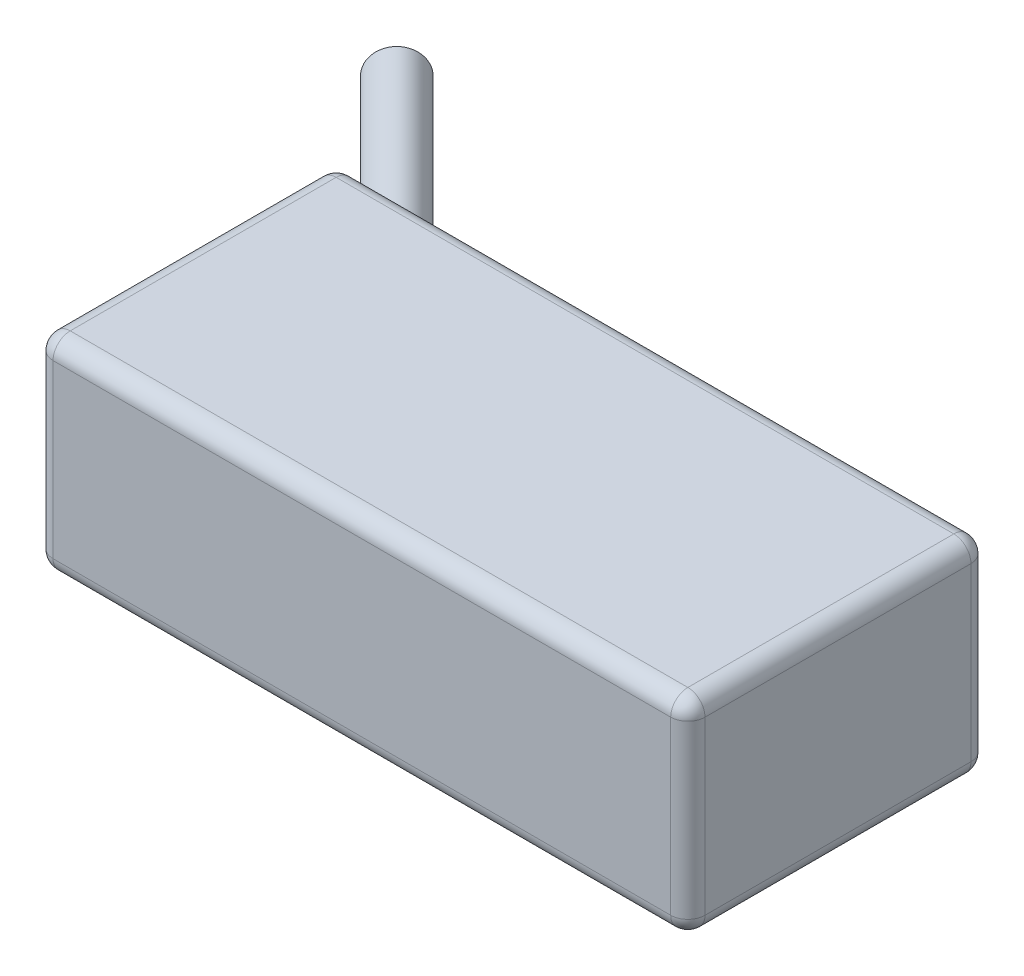
ISO-10303-21;
HEADER;
FILE_DESCRIPTION(('STEP AP214'),'2;1');
FILE_NAME('part.step','',(''),(''),'','','');
FILE_SCHEMA(('AUTOMOTIVE_DESIGN { 1 0 10303 214 1 1 1 1 }'));
ENDSEC;
DATA;
#1=APPLICATION_CONTEXT('core data for automotive mechanical design processes');
#2=APPLICATION_PROTOCOL_DEFINITION('international standard','automotive_design',2000,#1);
#3=PRODUCT_CONTEXT('',#1,'mechanical');
#4=PRODUCT('Part','Part','',(#3));
#5=PRODUCT_RELATED_PRODUCT_CATEGORY('part','',(#4));
#6=PRODUCT_DEFINITION_FORMATION('','',#4);
#7=PRODUCT_DEFINITION_CONTEXT('part definition',#1,'design');
#8=PRODUCT_DEFINITION('design','',#6,#7);
#9=PRODUCT_DEFINITION_SHAPE('','',#8);
#10=(LENGTH_UNIT() NAMED_UNIT(*) SI_UNIT(.MILLI.,.METRE.));
#11=(NAMED_UNIT(*) PLANE_ANGLE_UNIT() SI_UNIT($,.RADIAN.));
#12=(NAMED_UNIT(*) SI_UNIT($,.STERADIAN.) SOLID_ANGLE_UNIT());
#13=UNCERTAINTY_MEASURE_WITH_UNIT(LENGTH_MEASURE(1.E-05),#10,'distance_accuracy_value','');
#14=(GEOMETRIC_REPRESENTATION_CONTEXT(3) GLOBAL_UNCERTAINTY_ASSIGNED_CONTEXT((#13)) GLOBAL_UNIT_ASSIGNED_CONTEXT((#10,
#11,#12)) REPRESENTATION_CONTEXT('',''));
#15=CARTESIAN_POINT('',(0.,0.,0.));
#16=DIRECTION('',(0.,0.,1.));
#17=DIRECTION('',(1.,0.,0.));
#18=AXIS2_PLACEMENT_3D('',#15,#16,#17);
#19=CARTESIAN_POINT('',(38.,12.,-17.5));
#20=DIRECTION('',(-1.,0.,0.));
#21=DIRECTION('',(0.,0.,1.));
#22=AXIS2_PLACEMENT_3D('',#19,#20,#21);
#23=PLANE('',#22);
#24=DIRECTION('',(0.,-1.,0.));
#25=VECTOR('',#24,1.);
#26=CARTESIAN_POINT('',(38.,12.,15.5));
#27=LINE('',#26,#25);
#28=CARTESIAN_POINT('',(38.,10.,15.5));
#29=VERTEX_POINT('',#28);
#30=CARTESIAN_POINT('',(38.,-10.,15.5));
#31=VERTEX_POINT('',#30);
#32=EDGE_CURVE('E165',#29,#31,#27,.T.);
#33=ORIENTED_EDGE('',*,*,#32,.T.);
#34=DIRECTION('',(0.,0.,-1.));
#35=VECTOR('',#34,1.);
#36=CARTESIAN_POINT('',(38.,-10.,-17.5));
#37=LINE('',#36,#35);
#38=CARTESIAN_POINT('',(38.,-10.,-15.5));
#39=VERTEX_POINT('',#38);
#40=EDGE_CURVE('E170',#31,#39,#37,.T.);
#41=ORIENTED_EDGE('',*,*,#40,.T.);
#42=DIRECTION('',(0.,-1.,0.));
#43=VECTOR('',#42,1.);
#44=CARTESIAN_POINT('',(38.,12.,-15.5));
#45=LINE('',#44,#43);
#46=CARTESIAN_POINT('',(38.,10.,-15.5));
#47=VERTEX_POINT('',#46);
#48=EDGE_CURVE('E167',#39,#47,#45,.F.);
#49=ORIENTED_EDGE('',*,*,#48,.T.);
#50=DIRECTION('',(0.,0.,-1.));
#51=VECTOR('',#50,1.);
#52=CARTESIAN_POINT('',(38.,10.,17.5));
#53=LINE('',#52,#51);
#54=EDGE_CURVE('E163',#47,#29,#53,.F.);
#55=ORIENTED_EDGE('',*,*,#54,.T.);
#56=EDGE_LOOP('',(#33,#41,#49,#55));
#57=FACE_BOUND('',#56,.T.);
#58=ADVANCED_FACE('F36',(#57),#23,.F.);
#59=CARTESIAN_POINT('',(-38.,12.,-17.5));
#60=DIRECTION('',(0.,0.,1.));
#61=DIRECTION('',(1.,0.,0.));
#62=AXIS2_PLACEMENT_3D('',#59,#60,#61);
#63=PLANE('',#62);
#64=DIRECTION('',(0.,-1.,0.));
#65=VECTOR('',#64,1.);
#66=CARTESIAN_POINT('',(36.,12.,-17.5));
#67=LINE('',#66,#65);
#68=CARTESIAN_POINT('',(36.,10.,-17.5));
#69=VERTEX_POINT('',#68);
#70=CARTESIAN_POINT('',(36.,-10.,-17.5));
#71=VERTEX_POINT('',#70);
#72=EDGE_CURVE('E158',#69,#71,#67,.T.);
#73=ORIENTED_EDGE('',*,*,#72,.T.);
#74=DIRECTION('',(-1.,0.,0.));
#75=VECTOR('',#74,1.);
#76=CARTESIAN_POINT('',(-38.,-10.,-17.5));
#77=LINE('',#76,#75);
#78=CARTESIAN_POINT('',(-36.,-10.,-17.5));
#79=VERTEX_POINT('',#78);
#80=EDGE_CURVE('E161',#71,#79,#77,.T.);
#81=ORIENTED_EDGE('',*,*,#80,.T.);
#82=DIRECTION('',(0.,-1.,0.));
#83=VECTOR('',#82,1.);
#84=CARTESIAN_POINT('',(-36.,12.,-17.5));
#85=LINE('',#84,#83);
#86=CARTESIAN_POINT('',(-36.,10.,-17.5));
#87=VERTEX_POINT('',#86);
#88=EDGE_CURVE('E153',#79,#87,#85,.F.);
#89=ORIENTED_EDGE('',*,*,#88,.T.);
#90=DIRECTION('',(-1.,0.,0.));
#91=VECTOR('',#90,1.);
#92=CARTESIAN_POINT('',(38.,10.,-17.5));
#93=LINE('',#92,#91);
#94=EDGE_CURVE('E151',#87,#69,#93,.F.);
#95=ORIENTED_EDGE('',*,*,#94,.T.);
#96=EDGE_LOOP('',(#73,#81,#89,#95));
#97=FACE_BOUND('',#96,.T.);
#98=DIRECTION('',(0.,1.,0.));
#99=VECTOR('',#98,1.);
#100=CARTESIAN_POINT('',(-27.9999999999999,12.,-17.5));
#101=LINE('',#100,#99);
#102=CARTESIAN_POINT('',(-27.9999999999999,-6.17040966608938,-17.5));
#103=VERTEX_POINT('',#102);
#104=CARTESIAN_POINT('',(-27.9999999999999,-1.82959033391062,-17.5));
#105=VERTEX_POINT('',#104);
#106=EDGE_CURVE('E135',#103,#105,#101,.T.);
#107=ORIENTED_EDGE('',*,*,#106,.T.);
#108=CARTESIAN_POINT('',(-30.9289321881345,-4.,-17.5));
#109=DIRECTION('',(0.,0.,1.));
#110=DIRECTION('',(1.,0.,0.));
#111=AXIS2_PLACEMENT_3D('',#108,#109,#110);
#112=ELLIPSE('',#111,4.24264068711925,2.99999999999999);
#113=EDGE_CURVE('E142',#105,#103,#112,.T.);
#114=ORIENTED_EDGE('',*,*,#113,.T.);
#115=EDGE_LOOP('',(#107,#114));
#116=FACE_BOUND('',#115,.T.);
#117=DIRECTION('',(0.,1.,0.));
#118=VECTOR('',#117,1.);
#119=CARTESIAN_POINT('',(-27.9999999999999,12.,-17.5));
#120=LINE('',#119,#118);
#121=CARTESIAN_POINT('',(-27.9999999999999,1.8295903339106,-17.5));
#122=VERTEX_POINT('',#121);
#123=CARTESIAN_POINT('',(-27.9999999999999,6.1704096660894,-17.5));
#124=VERTEX_POINT('',#123);
#125=EDGE_CURVE('E627',#122,#124,#120,.T.);
#126=ORIENTED_EDGE('',*,*,#125,.T.);
#127=CARTESIAN_POINT('',(-30.9289321881345,4.,-17.5));
#128=DIRECTION('',(0.,0.,1.));
#129=DIRECTION('',(1.,0.,0.));
#130=AXIS2_PLACEMENT_3D('',#127,#128,#129);
#131=ELLIPSE('',#130,4.24264068711927,3.);
#132=EDGE_CURVE('E143',#124,#122,#131,.T.);
#133=ORIENTED_EDGE('',*,*,#132,.T.);
#134=EDGE_LOOP('',(#126,#133));
#135=FACE_BOUND('',#134,.T.);
#136=ADVANCED_FACE('F149',(#97,#116,#135),#63,.F.);
#137=CARTESIAN_POINT('',(-38.,12.,-17.5));
#138=DIRECTION('',(1.,0.,0.));
#139=DIRECTION('',(0.,0.,-1.));
#140=AXIS2_PLACEMENT_3D('',#137,#138,#139);
#141=PLANE('',#140);
#142=DIRECTION('',(0.,-1.,0.));
#143=VECTOR('',#142,1.);
#144=CARTESIAN_POINT('',(-38.,12.,-15.5));
#145=LINE('',#144,#143);
#146=CARTESIAN_POINT('',(-38.,10.,-15.5));
#147=VERTEX_POINT('',#146);
#148=CARTESIAN_POINT('',(-38.,-10.,-15.5));
#149=VERTEX_POINT('',#148);
#150=EDGE_CURVE('E176',#147,#149,#145,.T.);
#151=ORIENTED_EDGE('',*,*,#150,.T.);
#152=DIRECTION('',(0.,0.,1.));
#153=VECTOR('',#152,1.);
#154=CARTESIAN_POINT('',(-38.,-10.,-17.5));
#155=LINE('',#154,#153);
#156=CARTESIAN_POINT('',(-38.,-10.,15.5));
#157=VERTEX_POINT('',#156);
#158=EDGE_CURVE('E179',#149,#157,#155,.T.);
#159=ORIENTED_EDGE('',*,*,#158,.T.);
#160=DIRECTION('',(0.,-1.,0.));
#161=VECTOR('',#160,1.);
#162=CARTESIAN_POINT('',(-38.,12.,15.5));
#163=LINE('',#162,#161);
#164=CARTESIAN_POINT('',(-38.,10.,15.5));
#165=VERTEX_POINT('',#164);
#166=EDGE_CURVE('E174',#157,#165,#163,.F.);
#167=ORIENTED_EDGE('',*,*,#166,.T.);
#168=DIRECTION('',(0.,0.,1.));
#169=VECTOR('',#168,1.);
#170=CARTESIAN_POINT('',(-38.,10.,-17.5));
#171=LINE('',#170,#169);
#172=EDGE_CURVE('E172',#165,#147,#171,.F.);
#173=ORIENTED_EDGE('',*,*,#172,.T.);
#174=EDGE_LOOP('',(#151,#159,#167,#173));
#175=FACE_BOUND('',#174,.T.);
#176=ADVANCED_FACE('F318',(#175),#141,.F.);
#177=CARTESIAN_POINT('',(-38.,12.,17.5));
#178=DIRECTION('',(0.,0.,-1.));
#179=DIRECTION('',(-1.,0.,0.));
#180=AXIS2_PLACEMENT_3D('',#177,#178,#179);
#181=PLANE('',#180);
#182=DIRECTION('',(0.,-1.,0.));
#183=VECTOR('',#182,1.);
#184=CARTESIAN_POINT('',(-36.,12.,17.5));
#185=LINE('',#184,#183);
#186=CARTESIAN_POINT('',(-36.,10.,17.5));
#187=VERTEX_POINT('',#186);
#188=CARTESIAN_POINT('',(-36.,-10.,17.5));
#189=VERTEX_POINT('',#188);
#190=EDGE_CURVE('E185',#187,#189,#185,.T.);
#191=ORIENTED_EDGE('',*,*,#190,.T.);
#192=DIRECTION('',(1.,0.,0.));
#193=VECTOR('',#192,1.);
#194=CARTESIAN_POINT('',(-38.,-10.,17.5));
#195=LINE('',#194,#193);
#196=CARTESIAN_POINT('',(36.,-10.,17.5));
#197=VERTEX_POINT('',#196);
#198=EDGE_CURVE('E188',#189,#197,#195,.T.);
#199=ORIENTED_EDGE('',*,*,#198,.T.);
#200=DIRECTION('',(0.,-1.,0.));
#201=VECTOR('',#200,1.);
#202=CARTESIAN_POINT('',(36.,12.,17.5));
#203=LINE('',#202,#201);
#204=CARTESIAN_POINT('',(36.,10.,17.5));
#205=VERTEX_POINT('',#204);
#206=EDGE_CURVE('E183',#197,#205,#203,.F.);
#207=ORIENTED_EDGE('',*,*,#206,.T.);
#208=DIRECTION('',(1.,0.,0.));
#209=VECTOR('',#208,1.);
#210=CARTESIAN_POINT('',(-38.,10.,17.5));
#211=LINE('',#210,#209);
#212=EDGE_CURVE('E181',#205,#187,#211,.F.);
#213=ORIENTED_EDGE('',*,*,#212,.T.);
#214=EDGE_LOOP('',(#191,#199,#207,#213));
#215=FACE_BOUND('',#214,.T.);
#216=ADVANCED_FACE('F321',(#215),#181,.F.);
#217=CARTESIAN_POINT('',(0.,12.,0.));
#218=DIRECTION('',(0.,1.,0.));
#219=DIRECTION('',(0.,0.,1.));
#220=AXIS2_PLACEMENT_3D('',#217,#218,#219);
#221=PLANE('',#220);
#222=DIRECTION('',(0.,0.,1.));
#223=VECTOR('',#222,1.);
#224=CARTESIAN_POINT('',(-36.,12.,17.5));
#225=LINE('',#224,#223);
#226=CARTESIAN_POINT('',(-36.,12.,-15.5));
#227=VERTEX_POINT('',#226);
#228=CARTESIAN_POINT('',(-36.,12.,15.5));
#229=VERTEX_POINT('',#228);
#230=EDGE_CURVE('E45',#227,#229,#225,.T.);
#231=ORIENTED_EDGE('',*,*,#230,.T.);
#232=DIRECTION('',(1.,0.,0.));
#233=VECTOR('',#232,1.);
#234=CARTESIAN_POINT('',(38.,12.,15.5));
#235=LINE('',#234,#233);
#236=CARTESIAN_POINT('',(36.,12.,15.5));
#237=VERTEX_POINT('',#236);
#238=EDGE_CURVE('E11',#229,#237,#235,.T.);
#239=ORIENTED_EDGE('',*,*,#238,.T.);
#240=DIRECTION('',(0.,0.,-1.));
#241=VECTOR('',#240,1.);
#242=CARTESIAN_POINT('',(36.,12.,-17.5));
#243=LINE('',#242,#241);
#244=CARTESIAN_POINT('',(36.,12.,-15.5));
#245=VERTEX_POINT('',#244);
#246=EDGE_CURVE('E199',#237,#245,#243,.T.);
#247=ORIENTED_EDGE('',*,*,#246,.T.);
#248=DIRECTION('',(-1.,0.,0.));
#249=VECTOR('',#248,1.);
#250=CARTESIAN_POINT('',(-38.,12.,-15.5));
#251=LINE('',#250,#249);
#252=EDGE_CURVE('E56',#245,#227,#251,.T.);
#253=ORIENTED_EDGE('',*,*,#252,.T.);
#254=EDGE_LOOP('',(#231,#239,#247,#253));
#255=FACE_BOUND('',#254,.T.);
#256=ADVANCED_FACE('F285',(#255),#221,.T.);
#257=CARTESIAN_POINT('',(0.,-12.,0.));
#258=DIRECTION('',(0.,1.,0.));
#259=DIRECTION('',(0.,0.,1.));
#260=AXIS2_PLACEMENT_3D('',#257,#258,#259);
#261=PLANE('',#260);
#262=DIRECTION('',(0.,0.,1.));
#263=VECTOR('',#262,1.);
#264=CARTESIAN_POINT('',(-36.,-12.,0.));
#265=LINE('',#264,#263);
#266=CARTESIAN_POINT('',(-36.,-12.,15.5));
#267=VERTEX_POINT('',#266);
#268=CARTESIAN_POINT('',(-36.,-12.,-15.5));
#269=VERTEX_POINT('',#268);
#270=EDGE_CURVE('E194',#267,#269,#265,.F.);
#271=ORIENTED_EDGE('',*,*,#270,.T.);
#272=DIRECTION('',(-1.,0.,0.));
#273=VECTOR('',#272,1.);
#274=CARTESIAN_POINT('',(0.,-12.,-15.5));
#275=LINE('',#274,#273);
#276=CARTESIAN_POINT('',(36.,-12.,-15.5));
#277=VERTEX_POINT('',#276);
#278=EDGE_CURVE('E196',#269,#277,#275,.F.);
#279=ORIENTED_EDGE('',*,*,#278,.T.);
#280=DIRECTION('',(0.,0.,-1.));
#281=VECTOR('',#280,1.);
#282=CARTESIAN_POINT('',(36.,-12.,0.));
#283=LINE('',#282,#281);
#284=CARTESIAN_POINT('',(36.,-12.,15.5));
#285=VERTEX_POINT('',#284);
#286=EDGE_CURVE('E190',#277,#285,#283,.F.);
#287=ORIENTED_EDGE('',*,*,#286,.T.);
#288=DIRECTION('',(1.,0.,0.));
#289=VECTOR('',#288,1.);
#290=CARTESIAN_POINT('',(0.,-12.,15.5));
#291=LINE('',#290,#289);
#292=EDGE_CURVE('E192',#285,#267,#291,.F.);
#293=ORIENTED_EDGE('',*,*,#292,.T.);
#294=EDGE_LOOP('',(#271,#279,#287,#293));
#295=FACE_BOUND('',#294,.T.);
#296=ADVANCED_FACE('F565',(#295),#261,.F.);
#297=CARTESIAN_POINT('',(-50.6776695296635,4.,-37.2487373415292));
#298=DIRECTION('',(0.707106781186544,0.,0.707106781186551));
#299=DIRECTION('',(0.707106781186551,0.,-0.707106781186544));
#300=AXIS2_PLACEMENT_3D('',#297,#298,#299);
#301=CYLINDRICAL_SURFACE('',#300,3.);
#302=CARTESIAN_POINT('',(-50.6776695296635,4.,-37.2487373415292));
#303=DIRECTION('',(0.707106781186544,0.,0.707106781186551));
#304=DIRECTION('',(0.707106781186551,0.,-0.707106781186544));
#305=AXIS2_PLACEMENT_3D('',#302,#303,#304);
#306=CIRCLE('',#305,3.);
#307=CARTESIAN_POINT('',(-48.5563491861039,4.,-39.3700576850888));
#308=VERTEX_POINT('',#307);
#309=EDGE_CURVE('E621',#308,#308,#306,.T.);
#310=ORIENTED_EDGE('',*,*,#309,.T.);
#311=EDGE_LOOP('',(#310));
#312=FACE_BOUND('',#311,.T.);
#313=ORIENTED_EDGE('',*,*,#132,.F.);
#314=CARTESIAN_POINT('',(-29.4644660940672,4.,-16.0355339059326));
#315=DIRECTION('',(0.707106781186544,0.,0.707106781186551));
#316=DIRECTION('',(0.707106781186551,0.,-0.707106781186544));
#317=AXIS2_PLACEMENT_3D('',#314,#315,#316);
#318=CIRCLE('',#317,3.);
#319=EDGE_CURVE('E626',#122,#124,#318,.T.);
#320=ORIENTED_EDGE('',*,*,#319,.F.);
#321=EDGE_LOOP('',(#313,#320));
#322=FACE_BOUND('',#321,.T.);
#323=ADVANCED_FACE('F556',(#312,#322),#301,.T.);
#324=CARTESIAN_POINT('',(-29.4644660940672,4.,-16.0355339059326));
#325=DIRECTION('',(0.707106781186544,0.,0.707106781186551));
#326=DIRECTION('',(0.707106781186551,0.,-0.707106781186544));
#327=AXIS2_PLACEMENT_3D('',#324,#325,#326);
#328=PLANE('',#327);
#329=ORIENTED_EDGE('',*,*,#125,.F.);
#330=ORIENTED_EDGE('',*,*,#319,.T.);
#331=EDGE_LOOP('',(#329,#330));
#332=FACE_BOUND('',#331,.T.);
#333=ADVANCED_FACE('F547',(#332),#328,.T.);
#334=CARTESIAN_POINT('',(-50.6776695296635,4.,-37.2487373415292));
#335=DIRECTION('',(0.707106781186544,0.,0.707106781186551));
#336=DIRECTION('',(0.707106781186551,0.,-0.707106781186544));
#337=AXIS2_PLACEMENT_3D('',#334,#335,#336);
#338=PLANE('',#337);
#339=ORIENTED_EDGE('',*,*,#309,.F.);
#340=EDGE_LOOP('',(#339));
#341=FACE_BOUND('',#340,.T.);
#342=ADVANCED_FACE('F538',(#341),#338,.F.);
#343=CARTESIAN_POINT('',(-50.6776695296635,-4.,-37.2487373415292));
#344=DIRECTION('',(0.707106781186544,0.,0.707106781186551));
#345=DIRECTION('',(0.707106781186551,0.,-0.707106781186544));
#346=AXIS2_PLACEMENT_3D('',#343,#344,#345);
#347=CYLINDRICAL_SURFACE('',#346,2.99999999999999);
#348=CARTESIAN_POINT('',(-50.6776695296635,-4.,-37.2487373415292));
#349=DIRECTION('',(0.707106781186544,0.,0.707106781186551));
#350=DIRECTION('',(0.707106781186551,0.,-0.707106781186544));
#351=AXIS2_PLACEMENT_3D('',#348,#349,#350);
#352=CIRCLE('',#351,2.99999999999999);
#353=CARTESIAN_POINT('',(-48.5563491861039,-4.,-39.3700576850888));
#354=VERTEX_POINT('',#353);
#355=EDGE_CURVE('E147',#354,#354,#352,.T.);
#356=ORIENTED_EDGE('',*,*,#355,.T.);
#357=EDGE_LOOP('',(#356));
#358=FACE_BOUND('',#357,.T.);
#359=ORIENTED_EDGE('',*,*,#113,.F.);
#360=CARTESIAN_POINT('',(-29.4644660940672,-4.,-16.0355339059326));
#361=DIRECTION('',(0.707106781186544,0.,0.707106781186551));
#362=DIRECTION('',(0.707106781186551,0.,-0.707106781186544));
#363=AXIS2_PLACEMENT_3D('',#360,#361,#362);
#364=CIRCLE('',#363,2.99999999999999);
#365=EDGE_CURVE('E138',#103,#105,#364,.T.);
#366=ORIENTED_EDGE('',*,*,#365,.F.);
#367=EDGE_LOOP('',(#359,#366));
#368=FACE_BOUND('',#367,.T.);
#369=ADVANCED_FACE('F146',(#358,#368),#347,.T.);
#370=CARTESIAN_POINT('',(-29.4644660940672,-4.,-16.0355339059326));
#371=DIRECTION('',(0.707106781186544,0.,0.707106781186551));
#372=DIRECTION('',(0.707106781186551,0.,-0.707106781186544));
#373=AXIS2_PLACEMENT_3D('',#370,#371,#372);
#374=PLANE('',#373);
#375=ORIENTED_EDGE('',*,*,#106,.F.);
#376=ORIENTED_EDGE('',*,*,#365,.T.);
#377=EDGE_LOOP('',(#375,#376));
#378=FACE_BOUND('',#377,.T.);
#379=ADVANCED_FACE('F137',(#378),#374,.T.);
#380=CARTESIAN_POINT('',(-50.6776695296635,-4.,-37.2487373415292));
#381=DIRECTION('',(0.707106781186544,0.,0.707106781186551));
#382=DIRECTION('',(0.707106781186551,0.,-0.707106781186544));
#383=AXIS2_PLACEMENT_3D('',#380,#381,#382);
#384=PLANE('',#383);
#385=ORIENTED_EDGE('',*,*,#355,.F.);
#386=EDGE_LOOP('',(#385));
#387=FACE_BOUND('',#386,.T.);
#388=ADVANCED_FACE('F515',(#387),#384,.F.);
#389=CARTESIAN_POINT('',(-36.,12.,15.5));
#390=DIRECTION('',(0.,-1.,0.));
#391=DIRECTION('',(0.,0.,-1.));
#392=AXIS2_PLACEMENT_3D('',#389,#390,#391);
#393=CYLINDRICAL_SURFACE('',#392,2.);
#394=CARTESIAN_POINT('',(-36.,10.,15.5));
#395=DIRECTION('',(0.,1.,0.));
#396=DIRECTION('',(0.,0.,1.));
#397=AXIS2_PLACEMENT_3D('',#394,#395,#396);
#398=CIRCLE('',#397,2.);
#399=EDGE_CURVE('E40',#165,#187,#398,.T.);
#400=ORIENTED_EDGE('',*,*,#399,.F.);
#401=ORIENTED_EDGE('',*,*,#166,.F.);
#402=CARTESIAN_POINT('',(-36.,-10.,15.5));
#403=DIRECTION('',(0.,-1.,0.));
#404=DIRECTION('',(0.,0.,-1.));
#405=AXIS2_PLACEMENT_3D('',#402,#403,#404);
#406=CIRCLE('',#405,2.);
#407=EDGE_CURVE('E263',#189,#157,#406,.T.);
#408=ORIENTED_EDGE('',*,*,#407,.F.);
#409=ORIENTED_EDGE('',*,*,#190,.F.);
#410=EDGE_LOOP('',(#400,#401,#408,#409));
#411=FACE_BOUND('',#410,.T.);
#412=ADVANCED_FACE('F38',(#411),#393,.T.);
#413=CARTESIAN_POINT('',(-36.,10.,15.5));
#414=DIRECTION('',(0.,0.,1.));
#415=DIRECTION('',(1.,0.,0.));
#416=AXIS2_PLACEMENT_3D('',#413,#414,#415);
#417=SPHERICAL_SURFACE('',#416,2.);
#418=CARTESIAN_POINT('',(-36.,10.,15.5));
#419=DIRECTION('',(0.,0.,1.));
#420=DIRECTION('',(1.,0.,0.));
#421=AXIS2_PLACEMENT_3D('',#418,#419,#420);
#422=CIRCLE('',#421,2.);
#423=EDGE_CURVE('E259',#165,#229,#422,.F.);
#424=ORIENTED_EDGE('',*,*,#423,.F.);
#425=ORIENTED_EDGE('',*,*,#399,.T.);
#426=CARTESIAN_POINT('',(-36.,10.,15.5));
#427=DIRECTION('',(-1.,0.,0.));
#428=DIRECTION('',(0.,0.,1.));
#429=AXIS2_PLACEMENT_3D('',#426,#427,#428);
#430=CIRCLE('',#429,2.);
#431=EDGE_CURVE('E261',#229,#187,#430,.F.);
#432=ORIENTED_EDGE('',*,*,#431,.F.);
#433=EDGE_LOOP('',(#424,#425,#432));
#434=FACE_BOUND('',#433,.T.);
#435=ADVANCED_FACE('F274',(#434),#417,.T.);
#436=CARTESIAN_POINT('',(-36.,-10.,15.5));
#437=DIRECTION('',(-1.,0.,0.));
#438=DIRECTION('',(0.,-1.,0.));
#439=AXIS2_PLACEMENT_3D('',#436,#437,#438);
#440=SPHERICAL_SURFACE('',#439,2.);
#441=CARTESIAN_POINT('',(-36.,-10.,15.5));
#442=DIRECTION('',(-1.,0.,0.));
#443=DIRECTION('',(0.,0.,1.));
#444=AXIS2_PLACEMENT_3D('',#441,#442,#443);
#445=CIRCLE('',#444,2.);
#446=EDGE_CURVE('E253',#189,#267,#445,.F.);
#447=ORIENTED_EDGE('',*,*,#446,.F.);
#448=ORIENTED_EDGE('',*,*,#407,.T.);
#449=CARTESIAN_POINT('',(-36.,-10.,15.5));
#450=DIRECTION('',(0.,0.,1.));
#451=DIRECTION('',(1.,0.,0.));
#452=AXIS2_PLACEMENT_3D('',#449,#450,#451);
#453=CIRCLE('',#452,2.);
#454=EDGE_CURVE('E256',#267,#157,#453,.F.);
#455=ORIENTED_EDGE('',*,*,#454,.F.);
#456=EDGE_LOOP('',(#447,#448,#455));
#457=FACE_BOUND('',#456,.T.);
#458=ADVANCED_FACE('F389',(#457),#440,.T.);
#459=CARTESIAN_POINT('',(0.,10.,15.5));
#460=DIRECTION('',(-1.,0.,0.));
#461=DIRECTION('',(0.,0.,1.));
#462=AXIS2_PLACEMENT_3D('',#459,#460,#461);
#463=CYLINDRICAL_SURFACE('',#462,2.);
#464=ORIENTED_EDGE('',*,*,#431,.T.);
#465=ORIENTED_EDGE('',*,*,#212,.F.);
#466=CARTESIAN_POINT('',(36.,10.,15.5));
#467=DIRECTION('',(1.,0.,0.));
#468=DIRECTION('',(0.,0.,-1.));
#469=AXIS2_PLACEMENT_3D('',#466,#467,#468);
#470=CIRCLE('',#469,2.);
#471=EDGE_CURVE('E247',#237,#205,#470,.T.);
#472=ORIENTED_EDGE('',*,*,#471,.F.);
#473=ORIENTED_EDGE('',*,*,#238,.F.);
#474=EDGE_LOOP('',(#464,#465,#472,#473));
#475=FACE_BOUND('',#474,.T.);
#476=ADVANCED_FACE('F282',(#475),#463,.T.);
#477=CARTESIAN_POINT('',(-36.,10.,0.));
#478=DIRECTION('',(0.,0.,-1.));
#479=DIRECTION('',(-1.,0.,0.));
#480=AXIS2_PLACEMENT_3D('',#477,#478,#479);
#481=CYLINDRICAL_SURFACE('',#480,2.);
#482=ORIENTED_EDGE('',*,*,#423,.T.);
#483=ORIENTED_EDGE('',*,*,#230,.F.);
#484=CARTESIAN_POINT('',(-36.,10.,-15.5));
#485=DIRECTION('',(0.,0.,-1.));
#486=DIRECTION('',(-1.,0.,0.));
#487=AXIS2_PLACEMENT_3D('',#484,#485,#486);
#488=CIRCLE('',#487,2.);
#489=EDGE_CURVE('E244',#147,#227,#488,.T.);
#490=ORIENTED_EDGE('',*,*,#489,.F.);
#491=ORIENTED_EDGE('',*,*,#172,.F.);
#492=EDGE_LOOP('',(#482,#483,#490,#491));
#493=FACE_BOUND('',#492,.T.);
#494=ADVANCED_FACE('F316',(#493),#481,.T.);
#495=CARTESIAN_POINT('',(-36.,12.,-15.5));
#496=DIRECTION('',(0.,-1.,0.));
#497=DIRECTION('',(0.,0.,-1.));
#498=AXIS2_PLACEMENT_3D('',#495,#496,#497);
#499=CYLINDRICAL_SURFACE('',#498,2.);
#500=CARTESIAN_POINT('',(-36.,-10.,-15.5));
#501=DIRECTION('',(0.,-1.,0.));
#502=DIRECTION('',(0.,0.,-1.));
#503=AXIS2_PLACEMENT_3D('',#500,#501,#502);
#504=CIRCLE('',#503,2.);
#505=EDGE_CURVE('E238',#149,#79,#504,.T.);
#506=ORIENTED_EDGE('',*,*,#505,.F.);
#507=ORIENTED_EDGE('',*,*,#150,.F.);
#508=CARTESIAN_POINT('',(-36.,10.,-15.5));
#509=DIRECTION('',(0.,1.,0.));
#510=DIRECTION('',(0.,0.,1.));
#511=AXIS2_PLACEMENT_3D('',#508,#509,#510);
#512=CIRCLE('',#511,2.);
#513=EDGE_CURVE('E241',#87,#147,#512,.T.);
#514=ORIENTED_EDGE('',*,*,#513,.F.);
#515=ORIENTED_EDGE('',*,*,#88,.F.);
#516=EDGE_LOOP('',(#506,#507,#514,#515));
#517=FACE_BOUND('',#516,.T.);
#518=ADVANCED_FACE('F311',(#517),#499,.T.);
#519=CARTESIAN_POINT('',(-36.,-10.,-17.5));
#520=DIRECTION('',(0.,0.,1.));
#521=DIRECTION('',(1.,0.,0.));
#522=AXIS2_PLACEMENT_3D('',#519,#520,#521);
#523=CYLINDRICAL_SURFACE('',#522,2.);
#524=ORIENTED_EDGE('',*,*,#454,.T.);
#525=ORIENTED_EDGE('',*,*,#158,.F.);
#526=CARTESIAN_POINT('',(-36.,-10.,-15.5));
#527=DIRECTION('',(0.,0.,-1.));
#528=DIRECTION('',(-1.,0.,0.));
#529=AXIS2_PLACEMENT_3D('',#526,#527,#528);
#530=CIRCLE('',#529,2.);
#531=EDGE_CURVE('E236',#269,#149,#530,.T.);
#532=ORIENTED_EDGE('',*,*,#531,.F.);
#533=ORIENTED_EDGE('',*,*,#270,.F.);
#534=EDGE_LOOP('',(#524,#525,#532,#533));
#535=FACE_BOUND('',#534,.T.);
#536=ADVANCED_FACE('F388',(#535),#523,.T.);
#537=CARTESIAN_POINT('',(-38.,-10.,15.5));
#538=DIRECTION('',(1.,0.,0.));
#539=DIRECTION('',(0.,0.,-1.));
#540=AXIS2_PLACEMENT_3D('',#537,#538,#539);
#541=CYLINDRICAL_SURFACE('',#540,2.);
#542=ORIENTED_EDGE('',*,*,#446,.T.);
#543=ORIENTED_EDGE('',*,*,#292,.F.);
#544=CARTESIAN_POINT('',(36.,-10.,15.5));
#545=DIRECTION('',(1.,0.,0.));
#546=DIRECTION('',(0.,0.,-1.));
#547=AXIS2_PLACEMENT_3D('',#544,#545,#546);
#548=CIRCLE('',#547,2.);
#549=EDGE_CURVE('E233',#197,#285,#548,.T.);
#550=ORIENTED_EDGE('',*,*,#549,.F.);
#551=ORIENTED_EDGE('',*,*,#198,.F.);
#552=EDGE_LOOP('',(#542,#543,#550,#551));
#553=FACE_BOUND('',#552,.T.);
#554=ADVANCED_FACE('F331',(#553),#541,.T.);
#555=CARTESIAN_POINT('',(36.,12.,15.5));
#556=DIRECTION('',(0.,-1.,0.));
#557=DIRECTION('',(0.,0.,-1.));
#558=AXIS2_PLACEMENT_3D('',#555,#556,#557);
#559=CYLINDRICAL_SURFACE('',#558,2.);
#560=CARTESIAN_POINT('',(36.,10.,15.5));
#561=DIRECTION('',(0.,1.,0.));
#562=DIRECTION('',(0.,0.,1.));
#563=AXIS2_PLACEMENT_3D('',#560,#561,#562);
#564=CIRCLE('',#563,2.);
#565=EDGE_CURVE('E250',#205,#29,#564,.T.);
#566=ORIENTED_EDGE('',*,*,#565,.F.);
#567=ORIENTED_EDGE('',*,*,#206,.F.);
#568=CARTESIAN_POINT('',(36.,-10.,15.5));
#569=DIRECTION('',(0.,-1.,0.));
#570=DIRECTION('',(0.,0.,-1.));
#571=AXIS2_PLACEMENT_3D('',#568,#569,#570);
#572=CIRCLE('',#571,2.);
#573=EDGE_CURVE('E230',#31,#197,#572,.T.);
#574=ORIENTED_EDGE('',*,*,#573,.F.);
#575=ORIENTED_EDGE('',*,*,#32,.F.);
#576=EDGE_LOOP('',(#566,#567,#574,#575));
#577=FACE_BOUND('',#576,.T.);
#578=ADVANCED_FACE('F326',(#577),#559,.T.);
#579=CARTESIAN_POINT('',(36.,10.,15.5));
#580=DIRECTION('',(0.,0.,1.));
#581=DIRECTION('',(1.,0.,0.));
#582=AXIS2_PLACEMENT_3D('',#579,#580,#581);
#583=SPHERICAL_SURFACE('',#582,2.);
#584=ORIENTED_EDGE('',*,*,#471,.T.);
#585=ORIENTED_EDGE('',*,*,#565,.T.);
#586=CARTESIAN_POINT('',(36.,10.,15.5));
#587=DIRECTION('',(0.,0.,1.));
#588=DIRECTION('',(0.,-1.,0.));
#589=AXIS2_PLACEMENT_3D('',#586,#587,#588);
#590=CIRCLE('',#589,2.);
#591=EDGE_CURVE('E227',#237,#29,#590,.F.);
#592=ORIENTED_EDGE('',*,*,#591,.F.);
#593=EDGE_LOOP('',(#584,#585,#592));
#594=FACE_BOUND('',#593,.T.);
#595=ADVANCED_FACE('F341',(#594),#583,.T.);
#596=CARTESIAN_POINT('',(-36.,10.,-15.5));
#597=DIRECTION('',(-1.,0.,0.));
#598=DIRECTION('',(0.,0.,1.));
#599=AXIS2_PLACEMENT_3D('',#596,#597,#598);
#600=SPHERICAL_SURFACE('',#599,2.);
#601=ORIENTED_EDGE('',*,*,#513,.T.);
#602=ORIENTED_EDGE('',*,*,#489,.T.);
#603=CARTESIAN_POINT('',(-36.,10.,-15.5));
#604=DIRECTION('',(-1.,0.,0.));
#605=DIRECTION('',(0.,0.,1.));
#606=AXIS2_PLACEMENT_3D('',#603,#604,#605);
#607=CIRCLE('',#606,2.);
#608=EDGE_CURVE('E224',#87,#227,#607,.F.);
#609=ORIENTED_EDGE('',*,*,#608,.F.);
#610=EDGE_LOOP('',(#601,#602,#609));
#611=FACE_BOUND('',#610,.T.);
#612=ADVANCED_FACE('F314',(#611),#600,.T.);
#613=CARTESIAN_POINT('',(-36.,-10.,-15.5));
#614=DIRECTION('',(-1.,0.,0.));
#615=DIRECTION('',(0.,-1.,0.));
#616=AXIS2_PLACEMENT_3D('',#613,#614,#615);
#617=SPHERICAL_SURFACE('',#616,2.);
#618=ORIENTED_EDGE('',*,*,#531,.T.);
#619=ORIENTED_EDGE('',*,*,#505,.T.);
#620=CARTESIAN_POINT('',(-36.,-10.,-15.5));
#621=DIRECTION('',(-1.,0.,0.));
#622=DIRECTION('',(0.,0.,1.));
#623=AXIS2_PLACEMENT_3D('',#620,#621,#622);
#624=CIRCLE('',#623,2.);
#625=EDGE_CURVE('E221',#269,#79,#624,.F.);
#626=ORIENTED_EDGE('',*,*,#625,.F.);
#627=EDGE_LOOP('',(#618,#619,#626));
#628=FACE_BOUND('',#627,.T.);
#629=ADVANCED_FACE('F348',(#628),#617,.T.);
#630=CARTESIAN_POINT('',(36.,-10.,15.5));
#631=DIRECTION('',(0.,0.,1.));
#632=DIRECTION('',(0.,-1.,0.));
#633=AXIS2_PLACEMENT_3D('',#630,#631,#632);
#634=SPHERICAL_SURFACE('',#633,2.);
#635=ORIENTED_EDGE('',*,*,#573,.T.);
#636=ORIENTED_EDGE('',*,*,#549,.T.);
#637=CARTESIAN_POINT('',(36.,-10.,15.5));
#638=DIRECTION('',(0.,0.,1.));
#639=DIRECTION('',(1.,0.,0.));
#640=AXIS2_PLACEMENT_3D('',#637,#638,#639);
#641=CIRCLE('',#640,2.);
#642=EDGE_CURVE('E218',#31,#285,#641,.F.);
#643=ORIENTED_EDGE('',*,*,#642,.F.);
#644=EDGE_LOOP('',(#635,#636,#643));
#645=FACE_BOUND('',#644,.T.);
#646=ADVANCED_FACE('F333',(#645),#634,.T.);
#647=CARTESIAN_POINT('',(36.,10.,0.));
#648=DIRECTION('',(0.,0.,1.));
#649=DIRECTION('',(1.,0.,0.));
#650=AXIS2_PLACEMENT_3D('',#647,#648,#649);
#651=CYLINDRICAL_SURFACE('',#650,2.);
#652=ORIENTED_EDGE('',*,*,#591,.T.);
#653=ORIENTED_EDGE('',*,*,#54,.F.);
#654=CARTESIAN_POINT('',(36.,10.,-15.5));
#655=DIRECTION('',(0.,0.,-1.));
#656=DIRECTION('',(-1.,0.,0.));
#657=AXIS2_PLACEMENT_3D('',#654,#655,#656);
#658=CIRCLE('',#657,2.);
#659=EDGE_CURVE('E215',#245,#47,#658,.T.);
#660=ORIENTED_EDGE('',*,*,#659,.F.);
#661=ORIENTED_EDGE('',*,*,#246,.F.);
#662=EDGE_LOOP('',(#652,#653,#660,#661));
#663=FACE_BOUND('',#662,.T.);
#664=ADVANCED_FACE('F296',(#663),#651,.T.);
#665=CARTESIAN_POINT('',(0.,10.,-15.5));
#666=DIRECTION('',(1.,0.,0.));
#667=DIRECTION('',(0.,0.,-1.));
#668=AXIS2_PLACEMENT_3D('',#665,#666,#667);
#669=CYLINDRICAL_SURFACE('',#668,2.);
#670=ORIENTED_EDGE('',*,*,#608,.T.);
#671=ORIENTED_EDGE('',*,*,#252,.F.);
#672=CARTESIAN_POINT('',(36.,10.,-15.5));
#673=DIRECTION('',(1.,0.,0.));
#674=DIRECTION('',(0.,0.,-1.));
#675=AXIS2_PLACEMENT_3D('',#672,#673,#674);
#676=CIRCLE('',#675,2.);
#677=EDGE_CURVE('E212',#69,#245,#676,.T.);
#678=ORIENTED_EDGE('',*,*,#677,.F.);
#679=ORIENTED_EDGE('',*,*,#94,.F.);
#680=EDGE_LOOP('',(#670,#671,#678,#679));
#681=FACE_BOUND('',#680,.T.);
#682=ADVANCED_FACE('F291',(#681),#669,.T.);
#683=CARTESIAN_POINT('',(-38.,-10.,-15.5));
#684=DIRECTION('',(-1.,0.,0.));
#685=DIRECTION('',(0.,0.,1.));
#686=AXIS2_PLACEMENT_3D('',#683,#684,#685);
#687=CYLINDRICAL_SURFACE('',#686,2.);
#688=ORIENTED_EDGE('',*,*,#625,.T.);
#689=ORIENTED_EDGE('',*,*,#80,.F.);
#690=CARTESIAN_POINT('',(36.,-10.,-15.5));
#691=DIRECTION('',(1.,0.,0.));
#692=DIRECTION('',(0.,0.,-1.));
#693=AXIS2_PLACEMENT_3D('',#690,#691,#692);
#694=CIRCLE('',#693,2.);
#695=EDGE_CURVE('E209',#277,#71,#694,.T.);
#696=ORIENTED_EDGE('',*,*,#695,.F.);
#697=ORIENTED_EDGE('',*,*,#278,.F.);
#698=EDGE_LOOP('',(#688,#689,#696,#697));
#699=FACE_BOUND('',#698,.T.);
#700=ADVANCED_FACE('F369',(#699),#687,.T.);
#701=CARTESIAN_POINT('',(36.,-10.,-17.5));
#702=DIRECTION('',(0.,0.,-1.));
#703=DIRECTION('',(-1.,0.,0.));
#704=AXIS2_PLACEMENT_3D('',#701,#702,#703);
#705=CYLINDRICAL_SURFACE('',#704,2.);
#706=ORIENTED_EDGE('',*,*,#642,.T.);
#707=ORIENTED_EDGE('',*,*,#286,.F.);
#708=CARTESIAN_POINT('',(36.,-10.,-15.5));
#709=DIRECTION('',(0.,0.,-1.));
#710=DIRECTION('',(-1.,0.,0.));
#711=AXIS2_PLACEMENT_3D('',#708,#709,#710);
#712=CIRCLE('',#711,2.);
#713=EDGE_CURVE('E207',#39,#277,#712,.T.);
#714=ORIENTED_EDGE('',*,*,#713,.F.);
#715=ORIENTED_EDGE('',*,*,#40,.F.);
#716=EDGE_LOOP('',(#706,#707,#714,#715));
#717=FACE_BOUND('',#716,.T.);
#718=ADVANCED_FACE('F338',(#717),#705,.T.);
#719=CARTESIAN_POINT('',(36.,10.,-15.5));
#720=DIRECTION('',(0.,1.,0.));
#721=DIRECTION('',(0.,0.,1.));
#722=AXIS2_PLACEMENT_3D('',#719,#720,#721);
#723=SPHERICAL_SURFACE('',#722,2.);
#724=ORIENTED_EDGE('',*,*,#677,.T.);
#725=ORIENTED_EDGE('',*,*,#659,.T.);
#726=CARTESIAN_POINT('',(36.,10.,-15.5));
#727=DIRECTION('',(0.,1.,0.));
#728=DIRECTION('',(0.,0.,1.));
#729=AXIS2_PLACEMENT_3D('',#726,#727,#728);
#730=CIRCLE('',#729,2.);
#731=EDGE_CURVE('E205',#69,#47,#730,.F.);
#732=ORIENTED_EDGE('',*,*,#731,.F.);
#733=EDGE_LOOP('',(#724,#725,#732));
#734=FACE_BOUND('',#733,.T.);
#735=ADVANCED_FACE('F298',(#734),#723,.T.);
#736=CARTESIAN_POINT('',(36.,-10.,-15.5));
#737=DIRECTION('',(0.,-1.,0.));
#738=DIRECTION('',(0.,0.,-1.));
#739=AXIS2_PLACEMENT_3D('',#736,#737,#738);
#740=SPHERICAL_SURFACE('',#739,2.);
#741=ORIENTED_EDGE('',*,*,#713,.T.);
#742=ORIENTED_EDGE('',*,*,#695,.T.);
#743=CARTESIAN_POINT('',(36.,-10.,-15.5));
#744=DIRECTION('',(0.,-1.,0.));
#745=DIRECTION('',(0.,0.,-1.));
#746=AXIS2_PLACEMENT_3D('',#743,#744,#745);
#747=CIRCLE('',#746,2.);
#748=EDGE_CURVE('E203',#39,#71,#747,.F.);
#749=ORIENTED_EDGE('',*,*,#748,.F.);
#750=EDGE_LOOP('',(#741,#742,#749));
#751=FACE_BOUND('',#750,.T.);
#752=ADVANCED_FACE('F361',(#751),#740,.T.);
#753=CARTESIAN_POINT('',(36.,12.,-15.5));
#754=DIRECTION('',(0.,-1.,0.));
#755=DIRECTION('',(0.,0.,-1.));
#756=AXIS2_PLACEMENT_3D('',#753,#754,#755);
#757=CYLINDRICAL_SURFACE('',#756,2.);
#758=ORIENTED_EDGE('',*,*,#731,.T.);
#759=ORIENTED_EDGE('',*,*,#48,.F.);
#760=ORIENTED_EDGE('',*,*,#748,.T.);
#761=ORIENTED_EDGE('',*,*,#72,.F.);
#762=EDGE_LOOP('',(#758,#759,#760,#761));
#763=FACE_BOUND('',#762,.T.);
#764=ADVANCED_FACE('F302',(#763),#757,.T.);
#765=CLOSED_SHELL('',(#58,#136,#176,#216,#256,#296,#323,#333,#342,#369,#379,#388,#412,#435,#458,
#476,#494,#518,#536,#554,#578,#595,#612,#629,#646,#664,#682,#700,#718,#735,#752,#764));
#766=MANIFOLD_SOLID_BREP('B2',#765);
#767=ADVANCED_BREP_SHAPE_REPRESENTATION('',(#18,#766),#14);
#768=SHAPE_DEFINITION_REPRESENTATION(#9,#767);
ENDSEC;
END-ISO-10303-21;
